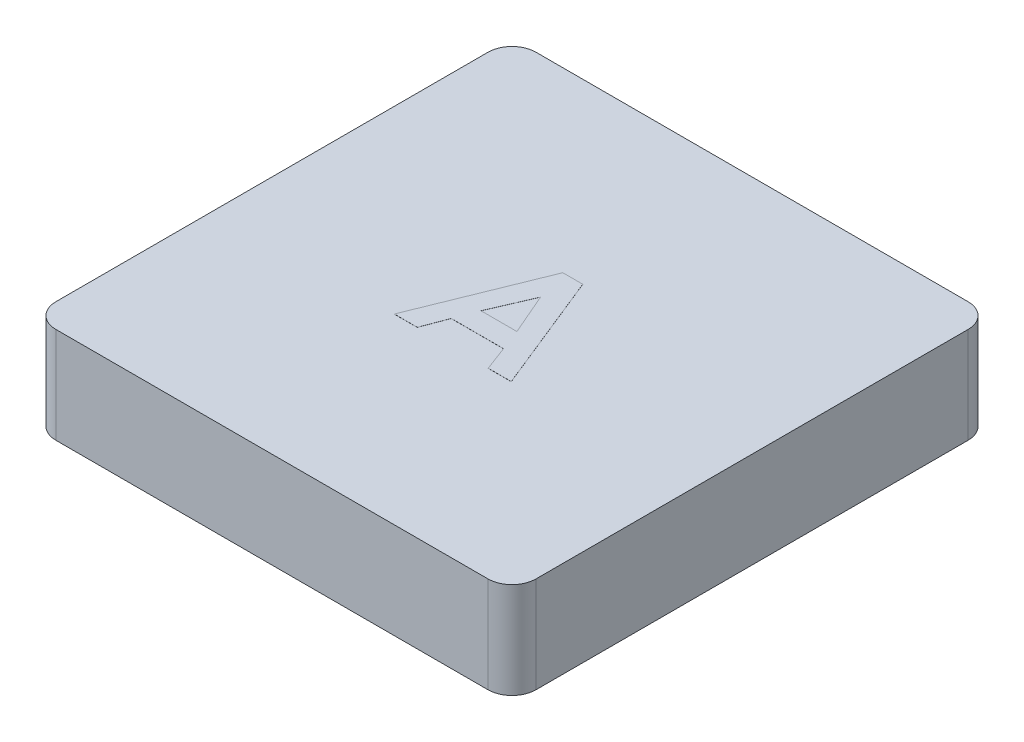
ISO-10303-21;
HEADER;
FILE_DESCRIPTION(('STEP AP214'),'2;1');
FILE_NAME('part.step','',(''),(''),'','','');
FILE_SCHEMA(('AUTOMOTIVE_DESIGN { 1 0 10303 214 1 1 1 1 }'));
ENDSEC;
DATA;
#1=APPLICATION_CONTEXT('core data for automotive mechanical design processes');
#2=APPLICATION_PROTOCOL_DEFINITION('international standard','automotive_design',2000,#1);
#3=PRODUCT_CONTEXT('',#1,'mechanical');
#4=PRODUCT('Part','Part','',(#3));
#5=PRODUCT_RELATED_PRODUCT_CATEGORY('part','',(#4));
#6=PRODUCT_DEFINITION_FORMATION('','',#4);
#7=PRODUCT_DEFINITION_CONTEXT('part definition',#1,'design');
#8=PRODUCT_DEFINITION('design','',#6,#7);
#9=PRODUCT_DEFINITION_SHAPE('','',#8);
#10=(LENGTH_UNIT() NAMED_UNIT(*) SI_UNIT(.MILLI.,.METRE.));
#11=(NAMED_UNIT(*) PLANE_ANGLE_UNIT() SI_UNIT($,.RADIAN.));
#12=(NAMED_UNIT(*) SI_UNIT($,.STERADIAN.) SOLID_ANGLE_UNIT());
#13=UNCERTAINTY_MEASURE_WITH_UNIT(LENGTH_MEASURE(1.E-05),#10,'distance_accuracy_value','');
#14=(GEOMETRIC_REPRESENTATION_CONTEXT(3) GLOBAL_UNCERTAINTY_ASSIGNED_CONTEXT((#13)) GLOBAL_UNIT_ASSIGNED_CONTEXT((#10,
#11,#12)) REPRESENTATION_CONTEXT('',''));
#15=CARTESIAN_POINT('',(0.,0.,0.));
#16=DIRECTION('',(0.,0.,1.));
#17=DIRECTION('',(1.,0.,0.));
#18=AXIS2_PLACEMENT_3D('',#15,#16,#17);
#19=CARTESIAN_POINT('',(0.,2.54,0.));
#20=DIRECTION('',(0.,1.,0.));
#21=DIRECTION('',(0.,0.,1.));
#22=AXIS2_PLACEMENT_3D('',#19,#20,#21);
#23=PLANE('',#22);
#24=DIRECTION('',(0.374622732778072,0.,-0.927177333677808));
#25=VECTOR('',#24,1.);
#26=CARTESIAN_POINT('',(4.76005769230769,2.54,-4.826));
#27=LINE('',#26,#25);
#28=CARTESIAN_POINT('',(4.76005769230769,2.54,-4.826));
#29=VERTEX_POINT('',#28);
#30=CARTESIAN_POINT('',(6.04290524839743,2.54,-8.001));
#31=VERTEX_POINT('',#30);
#32=EDGE_CURVE('E207',#29,#31,#27,.T.);
#33=ORIENTED_EDGE('',*,*,#32,.T.);
#34=DIRECTION('',(1.,0.,0.));
#35=VECTOR('',#34,1.);
#36=CARTESIAN_POINT('',(6.04290524839743,2.54,-8.001));
#37=LINE('',#36,#35);
#38=CARTESIAN_POINT('',(6.57143589743589,2.54,-8.001));
#39=VERTEX_POINT('',#38);
#40=EDGE_CURVE('E247',#31,#39,#37,.T.);
#41=ORIENTED_EDGE('',*,*,#40,.T.);
#42=DIRECTION('',(0.374463049601283,0.,0.92724183710794));
#43=VECTOR('',#42,1.);
#44=CARTESIAN_POINT('',(6.57143589743589,2.54,-8.001));
#45=LINE('',#44,#43);
#46=CARTESIAN_POINT('',(7.85364743589743,2.54,-4.826));
#47=VERTEX_POINT('',#46);
#48=EDGE_CURVE('E249',#39,#47,#45,.T.);
#49=ORIENTED_EDGE('',*,*,#48,.T.);
#50=DIRECTION('',(-1.,0.,0.));
#51=VECTOR('',#50,1.);
#52=CARTESIAN_POINT('',(7.85364743589743,2.54,-4.826));
#53=LINE('',#52,#51);
#54=CARTESIAN_POINT('',(7.24497856570512,2.54,-4.826));
#55=VERTEX_POINT('',#54);
#56=EDGE_CURVE('E251',#47,#55,#53,.T.);
#57=ORIENTED_EDGE('',*,*,#56,.T.);
#58=DIRECTION('',(-0.354323863096984,0.,-0.935122772709568));
#59=VECTOR('',#58,1.);
#60=CARTESIAN_POINT('',(7.24497856570512,2.54,-4.826));
#61=LINE('',#60,#59);
#62=CARTESIAN_POINT('',(6.99820372596154,2.54,-5.47728205128205));
#63=VERTEX_POINT('',#62);
#64=EDGE_CURVE('E253',#55,#63,#61,.T.);
#65=ORIENTED_EDGE('',*,*,#64,.T.);
#66=DIRECTION('',(-1.,0.,0.));
#67=VECTOR('',#66,1.);
#68=CARTESIAN_POINT('',(6.99820372596153,2.54,-5.47728205128205));
#69=LINE('',#68,#67);
#70=CARTESIAN_POINT('',(5.61486538461538,2.54,-5.47728205128205));
#71=VERTEX_POINT('',#70);
#72=EDGE_CURVE('E255',#63,#71,#69,.T.);
#73=ORIENTED_EDGE('',*,*,#72,.T.);
#74=DIRECTION('',(-0.354323863096985,0.,0.935122772709568));
#75=VECTOR('',#74,1.);
#76=CARTESIAN_POINT('',(5.61486538461538,2.54,-5.47728205128205));
#77=LINE('',#76,#75);
#78=CARTESIAN_POINT('',(5.36809054487179,2.54,-4.826));
#79=VERTEX_POINT('',#78);
#80=EDGE_CURVE('E53',#71,#79,#77,.T.);
#81=ORIENTED_EDGE('',*,*,#80,.T.);
#82=DIRECTION('',(-1.,0.,0.));
#83=VECTOR('',#82,1.);
#84=CARTESIAN_POINT('',(5.36809054487179,2.54,-4.826));
#85=LINE('',#84,#83);
#86=EDGE_CURVE('E48',#79,#29,#85,.T.);
#87=ORIENTED_EDGE('',*,*,#86,.T.);
#88=EDGE_LOOP('',(#33,#41,#49,#57,#65,#73,#81,#87));
#89=FACE_BOUND('',#88,.T.);
#90=DIRECTION('',(-1.,0.,0.));
#91=VECTOR('',#90,1.);
#92=CARTESIAN_POINT('',(12.7,2.54,-12.7));
#93=LINE('',#92,#91);
#94=CARTESIAN_POINT('',(12.065,2.54,-12.7));
#95=VERTEX_POINT('',#94);
#96=CARTESIAN_POINT('',(0.634999999999995,2.54,-12.7));
#97=VERTEX_POINT('',#96);
#98=EDGE_CURVE('E330',#95,#97,#93,.T.);
#99=ORIENTED_EDGE('',*,*,#98,.T.);
#100=CARTESIAN_POINT('',(0.634999999999995,2.54,-12.065));
#101=DIRECTION('',(0.,1.,0.));
#102=DIRECTION('',(0.,0.,1.));
#103=AXIS2_PLACEMENT_3D('',#100,#101,#102);
#104=CIRCLE('',#103,0.635);
#105=CARTESIAN_POINT('',(0.,2.54,-12.065));
#106=VERTEX_POINT('',#105);
#107=EDGE_CURVE('E367',#97,#106,#104,.T.);
#108=ORIENTED_EDGE('',*,*,#107,.T.);
#109=DIRECTION('',(0.,0.,1.));
#110=VECTOR('',#109,1.);
#111=CARTESIAN_POINT('',(0.,2.54,-12.7));
#112=LINE('',#111,#110);
#113=CARTESIAN_POINT('',(0.,2.54,-0.635));
#114=VERTEX_POINT('',#113);
#115=EDGE_CURVE('E320',#106,#114,#112,.T.);
#116=ORIENTED_EDGE('',*,*,#115,.T.);
#117=CARTESIAN_POINT('',(0.635,2.54,-0.635));
#118=DIRECTION('',(0.,1.,0.));
#119=DIRECTION('',(0.,0.,1.));
#120=AXIS2_PLACEMENT_3D('',#117,#118,#119);
#121=CIRCLE('',#120,0.635);
#122=CARTESIAN_POINT('',(0.635,2.54,0.));
#123=VERTEX_POINT('',#122);
#124=EDGE_CURVE('E361',#114,#123,#121,.T.);
#125=ORIENTED_EDGE('',*,*,#124,.T.);
#126=DIRECTION('',(1.,0.,0.));
#127=VECTOR('',#126,1.);
#128=CARTESIAN_POINT('',(0.,2.54,0.));
#129=LINE('',#128,#127);
#130=CARTESIAN_POINT('',(12.065,2.54,0.));
#131=VERTEX_POINT('',#130);
#132=EDGE_CURVE('E323',#123,#131,#129,.T.);
#133=ORIENTED_EDGE('',*,*,#132,.T.);
#134=CARTESIAN_POINT('',(12.065,2.54,-0.635));
#135=DIRECTION('',(0.,1.,0.));
#136=DIRECTION('',(0.,0.,1.));
#137=AXIS2_PLACEMENT_3D('',#134,#135,#136);
#138=CIRCLE('',#137,0.635);
#139=CARTESIAN_POINT('',(12.7,2.54,-0.635));
#140=VERTEX_POINT('',#139);
#141=EDGE_CURVE('E363',#131,#140,#138,.T.);
#142=ORIENTED_EDGE('',*,*,#141,.T.);
#143=DIRECTION('',(0.,0.,-1.));
#144=VECTOR('',#143,1.);
#145=CARTESIAN_POINT('',(12.7,2.54,0.));
#146=LINE('',#145,#144);
#147=CARTESIAN_POINT('',(12.7,2.54,-12.065));
#148=VERTEX_POINT('',#147);
#149=EDGE_CURVE('E327',#140,#148,#146,.T.);
#150=ORIENTED_EDGE('',*,*,#149,.T.);
#151=CARTESIAN_POINT('',(12.065,2.54,-12.065));
#152=DIRECTION('',(0.,1.,0.));
#153=DIRECTION('',(0.,0.,1.));
#154=AXIS2_PLACEMENT_3D('',#151,#152,#153);
#155=CIRCLE('',#154,0.635);
#156=EDGE_CURVE('E365',#148,#95,#155,.T.);
#157=ORIENTED_EDGE('',*,*,#156,.T.);
#158=EDGE_LOOP('',(#99,#108,#116,#125,#133,#142,#150,#157));
#159=FACE_BOUND('',#158,.T.);
#160=ADVANCED_FACE('F33',(#89,#159),#23,.T.);
#161=CARTESIAN_POINT('',(0.,2.54,-12.7));
#162=DIRECTION('',(1.,0.,0.));
#163=DIRECTION('',(0.,0.,-1.));
#164=AXIS2_PLACEMENT_3D('',#161,#162,#163);
#165=PLANE('',#164);
#166=ORIENTED_EDGE('',*,*,#115,.F.);
#167=DIRECTION('',(0.,-1.,0.));
#168=VECTOR('',#167,1.);
#169=CARTESIAN_POINT('',(0.,2.54,-12.065));
#170=LINE('',#169,#168);
#171=CARTESIAN_POINT('',(0.,0.,-12.065));
#172=VERTEX_POINT('',#171);
#173=EDGE_CURVE('E345',#106,#172,#170,.T.);
#174=ORIENTED_EDGE('',*,*,#173,.T.);
#175=DIRECTION('',(0.,0.,1.));
#176=VECTOR('',#175,1.);
#177=CARTESIAN_POINT('',(0.,0.,-12.7));
#178=LINE('',#177,#176);
#179=CARTESIAN_POINT('',(0.,0.,-0.635));
#180=VERTEX_POINT('',#179);
#181=EDGE_CURVE('E300',#172,#180,#178,.T.);
#182=ORIENTED_EDGE('',*,*,#181,.T.);
#183=DIRECTION('',(0.,-1.,0.));
#184=VECTOR('',#183,1.);
#185=CARTESIAN_POINT('',(0.,2.54,-0.635));
#186=LINE('',#185,#184);
#187=EDGE_CURVE('E333',#180,#114,#186,.F.);
#188=ORIENTED_EDGE('',*,*,#187,.T.);
#189=EDGE_LOOP('',(#166,#174,#182,#188));
#190=FACE_BOUND('',#189,.T.);
#191=ADVANCED_FACE('F411',(#190),#165,.F.);
#192=CARTESIAN_POINT('',(0.,2.54,0.));
#193=DIRECTION('',(0.,0.,-1.));
#194=DIRECTION('',(-1.,0.,0.));
#195=AXIS2_PLACEMENT_3D('',#192,#193,#194);
#196=PLANE('',#195);
#197=DIRECTION('',(1.,0.,0.));
#198=VECTOR('',#197,1.);
#199=CARTESIAN_POINT('',(0.,0.,0.));
#200=LINE('',#199,#198);
#201=CARTESIAN_POINT('',(0.635,0.,0.));
#202=VERTEX_POINT('',#201);
#203=CARTESIAN_POINT('',(12.065,0.,0.));
#204=VERTEX_POINT('',#203);
#205=EDGE_CURVE('E336',#202,#204,#200,.T.);
#206=ORIENTED_EDGE('',*,*,#205,.T.);
#207=DIRECTION('',(0.,-1.,0.));
#208=VECTOR('',#207,1.);
#209=CARTESIAN_POINT('',(12.065,2.54,0.));
#210=LINE('',#209,#208);
#211=EDGE_CURVE('E41',#204,#131,#210,.F.);
#212=ORIENTED_EDGE('',*,*,#211,.T.);
#213=ORIENTED_EDGE('',*,*,#132,.F.);
#214=DIRECTION('',(0.,-1.,0.));
#215=VECTOR('',#214,1.);
#216=CARTESIAN_POINT('',(0.635,2.54,0.));
#217=LINE('',#216,#215);
#218=EDGE_CURVE('E374',#123,#202,#217,.T.);
#219=ORIENTED_EDGE('',*,*,#218,.T.);
#220=EDGE_LOOP('',(#206,#212,#213,#219));
#221=FACE_BOUND('',#220,.T.);
#222=ADVANCED_FACE('F379',(#221),#196,.F.);
#223=CARTESIAN_POINT('',(12.7,2.54,0.));
#224=DIRECTION('',(-1.,0.,0.));
#225=DIRECTION('',(0.,0.,1.));
#226=AXIS2_PLACEMENT_3D('',#223,#224,#225);
#227=PLANE('',#226);
#228=DIRECTION('',(0.,0.,-1.));
#229=VECTOR('',#228,1.);
#230=CARTESIAN_POINT('',(12.7,0.,0.));
#231=LINE('',#230,#229);
#232=CARTESIAN_POINT('',(12.7,0.,-0.635));
#233=VERTEX_POINT('',#232);
#234=CARTESIAN_POINT('',(12.7,0.,-12.065));
#235=VERTEX_POINT('',#234);
#236=EDGE_CURVE('E339',#233,#235,#231,.T.);
#237=ORIENTED_EDGE('',*,*,#236,.T.);
#238=DIRECTION('',(0.,-1.,0.));
#239=VECTOR('',#238,1.);
#240=CARTESIAN_POINT('',(12.7,2.54,-12.065));
#241=LINE('',#240,#239);
#242=EDGE_CURVE('E372',#235,#148,#241,.F.);
#243=ORIENTED_EDGE('',*,*,#242,.T.);
#244=ORIENTED_EDGE('',*,*,#149,.F.);
#245=DIRECTION('',(0.,-1.,0.));
#246=VECTOR('',#245,1.);
#247=CARTESIAN_POINT('',(12.7,2.54,-0.635));
#248=LINE('',#247,#246);
#249=EDGE_CURVE('E369',#140,#233,#248,.T.);
#250=ORIENTED_EDGE('',*,*,#249,.T.);
#251=EDGE_LOOP('',(#237,#243,#244,#250));
#252=FACE_BOUND('',#251,.T.);
#253=ADVANCED_FACE('F391',(#252),#227,.F.);
#254=CARTESIAN_POINT('',(12.7,2.54,-12.7));
#255=DIRECTION('',(0.,0.,1.));
#256=DIRECTION('',(1.,0.,0.));
#257=AXIS2_PLACEMENT_3D('',#254,#255,#256);
#258=PLANE('',#257);
#259=DIRECTION('',(-1.,0.,0.));
#260=VECTOR('',#259,1.);
#261=CARTESIAN_POINT('',(12.7,0.,-12.7));
#262=LINE('',#261,#260);
#263=CARTESIAN_POINT('',(12.065,0.,-12.7));
#264=VERTEX_POINT('',#263);
#265=CARTESIAN_POINT('',(0.634999999999995,0.,-12.7));
#266=VERTEX_POINT('',#265);
#267=EDGE_CURVE('E324',#264,#266,#262,.T.);
#268=ORIENTED_EDGE('',*,*,#267,.T.);
#269=DIRECTION('',(0.,-1.,0.));
#270=VECTOR('',#269,1.);
#271=CARTESIAN_POINT('',(0.634999999999995,2.54,-12.7));
#272=LINE('',#271,#270);
#273=EDGE_CURVE('E359',#266,#97,#272,.F.);
#274=ORIENTED_EDGE('',*,*,#273,.T.);
#275=ORIENTED_EDGE('',*,*,#98,.F.);
#276=DIRECTION('',(0.,-1.,0.));
#277=VECTOR('',#276,1.);
#278=CARTESIAN_POINT('',(12.065,2.54,-12.7));
#279=LINE('',#278,#277);
#280=EDGE_CURVE('E356',#95,#264,#279,.T.);
#281=ORIENTED_EDGE('',*,*,#280,.T.);
#282=EDGE_LOOP('',(#268,#274,#275,#281));
#283=FACE_BOUND('',#282,.T.);
#284=ADVANCED_FACE('F403',(#283),#258,.F.);
#285=CARTESIAN_POINT('',(0.,0.,0.));
#286=DIRECTION('',(0.,1.,0.));
#287=DIRECTION('',(0.,0.,1.));
#288=AXIS2_PLACEMENT_3D('',#285,#286,#287);
#289=PLANE('',#288);
#290=DIRECTION('',(-1.,0.,0.));
#291=VECTOR('',#290,1.);
#292=CARTESIAN_POINT('',(12.7,0.,-12.065));
#293=LINE('',#292,#291);
#294=CARTESIAN_POINT('',(12.065,0.,-12.065));
#295=VERTEX_POINT('',#294);
#296=CARTESIAN_POINT('',(0.634999999999995,0.,-12.065));
#297=VERTEX_POINT('',#296);
#298=EDGE_CURVE('E288',#295,#297,#293,.T.);
#299=ORIENTED_EDGE('',*,*,#298,.T.);
#300=DIRECTION('',(0.,0.,1.));
#301=VECTOR('',#300,1.);
#302=CARTESIAN_POINT('',(0.634999999999995,0.,-12.7));
#303=LINE('',#302,#301);
#304=CARTESIAN_POINT('',(0.635,0.,-0.635));
#305=VERTEX_POINT('',#304);
#306=EDGE_CURVE('E283',#297,#305,#303,.T.);
#307=ORIENTED_EDGE('',*,*,#306,.T.);
#308=DIRECTION('',(1.,0.,0.));
#309=VECTOR('',#308,1.);
#310=CARTESIAN_POINT('',(0.,0.,-0.635));
#311=LINE('',#310,#309);
#312=CARTESIAN_POINT('',(12.065,0.,-0.635));
#313=VERTEX_POINT('',#312);
#314=EDGE_CURVE('E312',#305,#313,#311,.T.);
#315=ORIENTED_EDGE('',*,*,#314,.T.);
#316=DIRECTION('',(0.,0.,-1.));
#317=VECTOR('',#316,1.);
#318=CARTESIAN_POINT('',(12.065,0.,0.));
#319=LINE('',#318,#317);
#320=EDGE_CURVE('E315',#313,#295,#319,.T.);
#321=ORIENTED_EDGE('',*,*,#320,.T.);
#322=EDGE_LOOP('',(#299,#307,#315,#321));
#323=FACE_BOUND('',#322,.T.);
#324=ORIENTED_EDGE('',*,*,#181,.F.);
#325=CARTESIAN_POINT('',(0.634999999999995,0.,-12.065));
#326=DIRECTION('',(0.,1.,0.));
#327=DIRECTION('',(0.,0.,1.));
#328=AXIS2_PLACEMENT_3D('',#325,#326,#327);
#329=CIRCLE('',#328,0.635);
#330=EDGE_CURVE('E354',#172,#266,#329,.F.);
#331=ORIENTED_EDGE('',*,*,#330,.T.);
#332=ORIENTED_EDGE('',*,*,#267,.F.);
#333=CARTESIAN_POINT('',(12.065,0.,-12.065));
#334=DIRECTION('',(0.,1.,0.));
#335=DIRECTION('',(0.,0.,1.));
#336=AXIS2_PLACEMENT_3D('',#333,#334,#335);
#337=CIRCLE('',#336,0.635);
#338=EDGE_CURVE('E352',#264,#235,#337,.F.);
#339=ORIENTED_EDGE('',*,*,#338,.T.);
#340=ORIENTED_EDGE('',*,*,#236,.F.);
#341=CARTESIAN_POINT('',(12.065,0.,-0.635));
#342=DIRECTION('',(0.,1.,0.));
#343=DIRECTION('',(0.,0.,1.));
#344=AXIS2_PLACEMENT_3D('',#341,#342,#343);
#345=CIRCLE('',#344,0.635);
#346=EDGE_CURVE('E350',#233,#204,#345,.F.);
#347=ORIENTED_EDGE('',*,*,#346,.T.);
#348=ORIENTED_EDGE('',*,*,#205,.F.);
#349=CARTESIAN_POINT('',(0.635,0.,-0.635));
#350=DIRECTION('',(0.,1.,0.));
#351=DIRECTION('',(0.,0.,1.));
#352=AXIS2_PLACEMENT_3D('',#349,#350,#351);
#353=CIRCLE('',#352,0.635);
#354=EDGE_CURVE('E348',#202,#180,#353,.F.);
#355=ORIENTED_EDGE('',*,*,#354,.T.);
#356=EDGE_LOOP('',(#324,#331,#332,#339,#340,#347,#348,#355));
#357=FACE_BOUND('',#356,.T.);
#358=ADVANCED_FACE('F395',(#323,#357),#289,.F.);
#359=CARTESIAN_POINT('',(0.634999999999995,2.54,-12.065));
#360=DIRECTION('',(0.,-1.,0.));
#361=DIRECTION('',(0.,0.,-1.));
#362=AXIS2_PLACEMENT_3D('',#359,#360,#361);
#363=CYLINDRICAL_SURFACE('',#362,0.635);
#364=ORIENTED_EDGE('',*,*,#107,.F.);
#365=ORIENTED_EDGE('',*,*,#273,.F.);
#366=ORIENTED_EDGE('',*,*,#330,.F.);
#367=ORIENTED_EDGE('',*,*,#173,.F.);
#368=EDGE_LOOP('',(#364,#365,#366,#367));
#369=FACE_BOUND('',#368,.T.);
#370=ADVANCED_FACE('F409',(#369),#363,.T.);
#371=CARTESIAN_POINT('',(12.065,2.54,-12.065));
#372=DIRECTION('',(0.,-1.,0.));
#373=DIRECTION('',(0.,0.,-1.));
#374=AXIS2_PLACEMENT_3D('',#371,#372,#373);
#375=CYLINDRICAL_SURFACE('',#374,0.635);
#376=ORIENTED_EDGE('',*,*,#156,.F.);
#377=ORIENTED_EDGE('',*,*,#242,.F.);
#378=ORIENTED_EDGE('',*,*,#338,.F.);
#379=ORIENTED_EDGE('',*,*,#280,.F.);
#380=EDGE_LOOP('',(#376,#377,#378,#379));
#381=FACE_BOUND('',#380,.T.);
#382=ADVANCED_FACE('F400',(#381),#375,.T.);
#383=CARTESIAN_POINT('',(12.065,2.54,-0.635));
#384=DIRECTION('',(0.,-1.,0.));
#385=DIRECTION('',(0.,0.,-1.));
#386=AXIS2_PLACEMENT_3D('',#383,#384,#385);
#387=CYLINDRICAL_SURFACE('',#386,0.635);
#388=ORIENTED_EDGE('',*,*,#141,.F.);
#389=ORIENTED_EDGE('',*,*,#211,.F.);
#390=ORIENTED_EDGE('',*,*,#346,.F.);
#391=ORIENTED_EDGE('',*,*,#249,.F.);
#392=EDGE_LOOP('',(#388,#389,#390,#391));
#393=FACE_BOUND('',#392,.T.);
#394=ADVANCED_FACE('F388',(#393),#387,.T.);
#395=CARTESIAN_POINT('',(0.635,2.54,-0.635));
#396=DIRECTION('',(0.,-1.,0.));
#397=DIRECTION('',(0.,0.,-1.));
#398=AXIS2_PLACEMENT_3D('',#395,#396,#397);
#399=CYLINDRICAL_SURFACE('',#398,0.635);
#400=ORIENTED_EDGE('',*,*,#124,.F.);
#401=ORIENTED_EDGE('',*,*,#187,.F.);
#402=ORIENTED_EDGE('',*,*,#354,.F.);
#403=ORIENTED_EDGE('',*,*,#218,.F.);
#404=EDGE_LOOP('',(#400,#401,#402,#403));
#405=FACE_BOUND('',#404,.T.);
#406=ADVANCED_FACE('F35',(#405),#399,.T.);
#407=CARTESIAN_POINT('',(0.634999999999995,2.54,-12.7));
#408=DIRECTION('',(1.,0.,0.));
#409=DIRECTION('',(0.,0.,-1.));
#410=AXIS2_PLACEMENT_3D('',#407,#408,#409);
#411=PLANE('',#410);
#412=DIRECTION('',(0.,0.,1.));
#413=VECTOR('',#412,1.);
#414=CARTESIAN_POINT('',(0.634999999999995,1.905,-12.7));
#415=LINE('',#414,#413);
#416=CARTESIAN_POINT('',(0.634999999999995,1.905,-12.065));
#417=VERTEX_POINT('',#416);
#418=CARTESIAN_POINT('',(0.635,1.905,-0.635));
#419=VERTEX_POINT('',#418);
#420=EDGE_CURVE('E284',#417,#419,#415,.T.);
#421=ORIENTED_EDGE('',*,*,#420,.T.);
#422=DIRECTION('',(0.,1.,0.));
#423=VECTOR('',#422,1.);
#424=CARTESIAN_POINT('',(0.635,2.54,-0.635));
#425=LINE('',#424,#423);
#426=EDGE_CURVE('E293',#305,#419,#425,.T.);
#427=ORIENTED_EDGE('',*,*,#426,.F.);
#428=ORIENTED_EDGE('',*,*,#306,.F.);
#429=DIRECTION('',(0.,1.,0.));
#430=VECTOR('',#429,1.);
#431=CARTESIAN_POINT('',(0.634999999999995,2.54,-12.065));
#432=LINE('',#431,#430);
#433=EDGE_CURVE('E289',#297,#417,#432,.T.);
#434=ORIENTED_EDGE('',*,*,#433,.T.);
#435=EDGE_LOOP('',(#421,#427,#428,#434));
#436=FACE_BOUND('',#435,.T.);
#437=ADVANCED_FACE('F415',(#436),#411,.T.);
#438=CARTESIAN_POINT('',(0.,2.54,-0.635));
#439=DIRECTION('',(0.,0.,-1.));
#440=DIRECTION('',(-1.,0.,0.));
#441=AXIS2_PLACEMENT_3D('',#438,#439,#440);
#442=PLANE('',#441);
#443=ORIENTED_EDGE('',*,*,#314,.F.);
#444=ORIENTED_EDGE('',*,*,#426,.T.);
#445=DIRECTION('',(1.,0.,0.));
#446=VECTOR('',#445,1.);
#447=CARTESIAN_POINT('',(0.,1.905,-0.635));
#448=LINE('',#447,#446);
#449=CARTESIAN_POINT('',(12.065,1.905,-0.635));
#450=VERTEX_POINT('',#449);
#451=EDGE_CURVE('E287',#419,#450,#448,.T.);
#452=ORIENTED_EDGE('',*,*,#451,.T.);
#453=DIRECTION('',(0.,1.,0.));
#454=VECTOR('',#453,1.);
#455=CARTESIAN_POINT('',(12.065,2.54,-0.635));
#456=LINE('',#455,#454);
#457=EDGE_CURVE('E297',#313,#450,#456,.T.);
#458=ORIENTED_EDGE('',*,*,#457,.F.);
#459=EDGE_LOOP('',(#443,#444,#452,#458));
#460=FACE_BOUND('',#459,.T.);
#461=ADVANCED_FACE('F420',(#460),#442,.T.);
#462=CARTESIAN_POINT('',(12.065,2.54,0.));
#463=DIRECTION('',(-1.,0.,0.));
#464=DIRECTION('',(0.,0.,1.));
#465=AXIS2_PLACEMENT_3D('',#462,#463,#464);
#466=PLANE('',#465);
#467=ORIENTED_EDGE('',*,*,#320,.F.);
#468=ORIENTED_EDGE('',*,*,#457,.T.);
#469=DIRECTION('',(0.,0.,-1.));
#470=VECTOR('',#469,1.);
#471=CARTESIAN_POINT('',(12.065,1.905,0.));
#472=LINE('',#471,#470);
#473=CARTESIAN_POINT('',(12.065,1.905,-12.065));
#474=VERTEX_POINT('',#473);
#475=EDGE_CURVE('E303',#450,#474,#472,.T.);
#476=ORIENTED_EDGE('',*,*,#475,.T.);
#477=DIRECTION('',(0.,1.,0.));
#478=VECTOR('',#477,1.);
#479=CARTESIAN_POINT('',(12.065,2.54,-12.065));
#480=LINE('',#479,#478);
#481=EDGE_CURVE('E292',#295,#474,#480,.T.);
#482=ORIENTED_EDGE('',*,*,#481,.F.);
#483=EDGE_LOOP('',(#467,#468,#476,#482));
#484=FACE_BOUND('',#483,.T.);
#485=ADVANCED_FACE('F494',(#484),#466,.T.);
#486=CARTESIAN_POINT('',(12.7,2.54,-12.065));
#487=DIRECTION('',(0.,0.,1.));
#488=DIRECTION('',(1.,0.,0.));
#489=AXIS2_PLACEMENT_3D('',#486,#487,#488);
#490=PLANE('',#489);
#491=ORIENTED_EDGE('',*,*,#298,.F.);
#492=ORIENTED_EDGE('',*,*,#481,.T.);
#493=DIRECTION('',(-1.,0.,0.));
#494=VECTOR('',#493,1.);
#495=CARTESIAN_POINT('',(12.7,1.905,-12.065));
#496=LINE('',#495,#494);
#497=EDGE_CURVE('E296',#474,#417,#496,.T.);
#498=ORIENTED_EDGE('',*,*,#497,.T.);
#499=ORIENTED_EDGE('',*,*,#433,.F.);
#500=EDGE_LOOP('',(#491,#492,#498,#499));
#501=FACE_BOUND('',#500,.T.);
#502=ADVANCED_FACE('F498',(#501),#490,.T.);
#503=CARTESIAN_POINT('',(0.,1.905,0.));
#504=DIRECTION('',(0.,1.,0.));
#505=DIRECTION('',(0.,0.,1.));
#506=AXIS2_PLACEMENT_3D('',#503,#504,#505);
#507=PLANE('',#506);
#508=CARTESIAN_POINT('',(6.34999999999999,1.905,-6.35));
#509=DIRECTION('',(0.,1.,0.));
#510=DIRECTION('',(0.,0.,1.));
#511=AXIS2_PLACEMENT_3D('',#508,#509,#510);
#512=CIRCLE('',#511,2.54);
#513=CARTESIAN_POINT('',(6.34999999999999,1.905,-3.81));
#514=VERTEX_POINT('',#513);
#515=EDGE_CURVE('E11',#514,#514,#512,.F.);
#516=ORIENTED_EDGE('',*,*,#515,.F.);
#517=EDGE_LOOP('',(#516));
#518=FACE_BOUND('',#517,.T.);
#519=ORIENTED_EDGE('',*,*,#497,.F.);
#520=ORIENTED_EDGE('',*,*,#475,.F.);
#521=ORIENTED_EDGE('',*,*,#451,.F.);
#522=ORIENTED_EDGE('',*,*,#420,.F.);
#523=EDGE_LOOP('',(#519,#520,#521,#522));
#524=FACE_BOUND('',#523,.T.);
#525=ADVANCED_FACE('F489',(#518,#524),#507,.F.);
#526=CARTESIAN_POINT('',(6.34999999999999,-7.18420489685532,-6.35));
#527=DIRECTION('',(0.,1.,0.));
#528=DIRECTION('',(0.,0.,1.));
#529=AXIS2_PLACEMENT_3D('',#526,#527,#528);
#530=CYLINDRICAL_SURFACE('',#529,2.54);
#531=CARTESIAN_POINT('',(6.34999999999999,0.,-6.35));
#532=DIRECTION('',(0.,1.,0.));
#533=DIRECTION('',(0.,0.,1.));
#534=AXIS2_PLACEMENT_3D('',#531,#532,#533);
#535=CIRCLE('',#534,2.54);
#536=CARTESIAN_POINT('',(6.34999999999999,0.,-3.81));
#537=VERTEX_POINT('',#536);
#538=EDGE_CURVE('E261',#537,#537,#535,.T.);
#539=CARTESIAN_POINT('',(6.34999999999999,0.,-3.81));
#540=CARTESIAN_POINT('',(6.34999999999999,0.0198437499999991,-3.81));
#541=CARTESIAN_POINT('',(6.34999999999999,0.0396874999999989,-3.81));
#542=CARTESIAN_POINT('',(6.34999999999999,0.079374999999999,-3.81));
#543=CARTESIAN_POINT('',(6.34999999999999,0.0992187499999992,-3.81));
#544=CARTESIAN_POINT('',(6.34999999999999,0.138906249999999,-3.81));
#545=CARTESIAN_POINT('',(6.34999999999999,0.158749999999999,-3.81));
#546=CARTESIAN_POINT('',(6.34999999999999,0.198437499999999,-3.81));
#547=CARTESIAN_POINT('',(6.34999999999999,0.218281249999999,-3.81));
#548=CARTESIAN_POINT('',(6.34999999999999,0.25796875,-3.81));
#549=CARTESIAN_POINT('',(6.34999999999999,0.277812499999999,-3.81));
#550=CARTESIAN_POINT('',(6.34999999999999,0.317499999999999,-3.81));
#551=CARTESIAN_POINT('',(6.34999999999999,0.337343749999999,-3.81));
#552=CARTESIAN_POINT('',(6.34999999999999,0.377031249999999,-3.81));
#553=CARTESIAN_POINT('',(6.34999999999999,0.396874999999999,-3.81));
#554=CARTESIAN_POINT('',(6.34999999999999,0.436562499999999,-3.81));
#555=CARTESIAN_POINT('',(6.34999999999999,0.456406249999999,-3.81));
#556=CARTESIAN_POINT('',(6.34999999999999,0.496093749999999,-3.81));
#557=CARTESIAN_POINT('',(6.34999999999999,0.515937499999999,-3.81));
#558=CARTESIAN_POINT('',(6.34999999999999,0.555624999999999,-3.81));
#559=CARTESIAN_POINT('',(6.34999999999999,0.575468749999999,-3.81));
#560=CARTESIAN_POINT('',(6.34999999999999,0.615156249999999,-3.81));
#561=CARTESIAN_POINT('',(6.34999999999999,0.634999999999999,-3.81));
#562=CARTESIAN_POINT('',(6.34999999999999,0.674687499999998,-3.81));
#563=CARTESIAN_POINT('',(6.34999999999999,0.694531249999998,-3.81));
#564=CARTESIAN_POINT('',(6.34999999999999,0.734218749999998,-3.81));
#565=CARTESIAN_POINT('',(6.34999999999999,0.754062499999998,-3.81));
#566=CARTESIAN_POINT('',(6.34999999999999,0.793749999999998,-3.81));
#567=CARTESIAN_POINT('',(6.34999999999999,0.813593749999999,-3.81));
#568=CARTESIAN_POINT('',(6.34999999999999,0.853281249999999,-3.81));
#569=CARTESIAN_POINT('',(6.34999999999999,0.873124999999999,-3.81));
#570=CARTESIAN_POINT('',(6.34999999999999,0.912812499999999,-3.81));
#571=CARTESIAN_POINT('',(6.34999999999999,0.932656249999999,-3.81));
#572=CARTESIAN_POINT('',(6.34999999999999,0.972343749999998,-3.81));
#573=CARTESIAN_POINT('',(6.34999999999999,0.992187499999998,-3.81));
#574=CARTESIAN_POINT('',(6.34999999999999,1.031875,-3.81));
#575=CARTESIAN_POINT('',(6.34999999999999,1.05171875,-3.81));
#576=CARTESIAN_POINT('',(6.34999999999999,1.09140625,-3.81));
#577=CARTESIAN_POINT('',(6.34999999999999,1.11125,-3.81));
#578=CARTESIAN_POINT('',(6.34999999999999,1.1509375,-3.81));
#579=CARTESIAN_POINT('',(6.34999999999999,1.17078125,-3.81));
#580=CARTESIAN_POINT('',(6.34999999999999,1.21046875,-3.81));
#581=CARTESIAN_POINT('',(6.34999999999999,1.2303125,-3.81));
#582=CARTESIAN_POINT('',(6.34999999999999,1.27,-3.81));
#583=CARTESIAN_POINT('',(6.34999999999999,1.28984375,-3.81));
#584=CARTESIAN_POINT('',(6.34999999999999,1.32953125,-3.81));
#585=CARTESIAN_POINT('',(6.34999999999999,1.349375,-3.81));
#586=CARTESIAN_POINT('',(6.34999999999999,1.3890625,-3.81));
#587=CARTESIAN_POINT('',(6.34999999999999,1.40890625,-3.81));
#588=CARTESIAN_POINT('',(6.34999999999999,1.44859375,-3.81));
#589=CARTESIAN_POINT('',(6.34999999999999,1.4684375,-3.81));
#590=CARTESIAN_POINT('',(6.34999999999999,1.508125,-3.81));
#591=CARTESIAN_POINT('',(6.34999999999999,1.52796875,-3.81));
#592=CARTESIAN_POINT('',(6.34999999999999,1.56765625,-3.81));
#593=CARTESIAN_POINT('',(6.34999999999999,1.5875,-3.81));
#594=CARTESIAN_POINT('',(6.34999999999999,1.6271875,-3.81));
#595=CARTESIAN_POINT('',(6.34999999999999,1.64703125,-3.81));
#596=CARTESIAN_POINT('',(6.34999999999999,1.68671875,-3.81));
#597=CARTESIAN_POINT('',(6.34999999999999,1.7065625,-3.81));
#598=CARTESIAN_POINT('',(6.34999999999999,1.74625,-3.81));
#599=CARTESIAN_POINT('',(6.34999999999999,1.76609375,-3.81));
#600=CARTESIAN_POINT('',(6.34999999999999,1.80578125,-3.81));
#601=CARTESIAN_POINT('',(6.34999999999999,1.825625,-3.81));
#602=CARTESIAN_POINT('',(6.34999999999999,1.8653125,-3.81));
#603=CARTESIAN_POINT('',(6.34999999999999,1.88515625,-3.81));
#604=CARTESIAN_POINT('',(6.34999999999999,1.905,-3.81));
#605=B_SPLINE_CURVE_WITH_KNOTS('',3,(#539,#540,#541,#542,#543,#544,#545,#546,#547,#548,#549,
#550,#551,#552,#553,#554,#555,#556,#557,#558,#559,#560,#561,#562,#563,#564,#565,#566,#567,#568,
#569,#570,#571,#572,#573,#574,#575,#576,#577,#578,#579,#580,#581,#582,#583,#584,#585,#586,#587,
#588,#589,#590,#591,#592,#593,#594,#595,#596,#597,#598,#599,#600,#601,#602,#603,#604),
.UNSPECIFIED.,.F.,.F.,(4,2,2,2,2,2,2,2,2,2,2,2,2,2,2,2,2,2,2,2,2,2,2,2,2,2,2,2,2,2,2,2,4),(0.,
0.0595312499999997,0.1190625,0.17859375,0.238125,0.29765625,0.3571875,0.41671875,0.47625,
0.53578125,0.5953125,0.654843749999999,0.714374999999999,0.773906249999999,0.8334375,0.89296875,
0.952499999999999,1.01203125,1.0715625,1.13109375,1.190625,1.25015625,1.3096875,1.36921875,
1.42875,1.48828125,1.5478125,1.60734375,1.666875,1.72640625,1.7859375,1.84546875,1.905),.UNSPECIFIED.);
#606=EDGE_CURVE('BSEAM486',#537,#514,#605,.T.);
#607=ORIENTED_EDGE('',*,*,#538,.T.);
#608=ORIENTED_EDGE('',*,*,#515,.T.);
#609=ORIENTED_EDGE('',*,*,#606,.T.);
#610=ORIENTED_EDGE('',*,*,#606,.F.);
#611=EDGE_LOOP('',(#607,#609,#608,#610));
#612=FACE_BOUND('',#611,.T.);
#613=ADVANCED_FACE('F486',(#612),#530,.T.);
#614=CARTESIAN_POINT('',(0.,0.,0.));
#615=DIRECTION('',(0.,1.,0.));
#616=DIRECTION('',(0.,0.,1.));
#617=AXIS2_PLACEMENT_3D('',#614,#615,#616);
#618=PLANE('',#617);
#619=ORIENTED_EDGE('',*,*,#538,.F.);
#620=EDGE_LOOP('',(#619));
#621=FACE_BOUND('',#620,.T.);
#622=ADVANCED_FACE('F452',(#621),#618,.F.);
#623=CARTESIAN_POINT('',(0.,2.54254,0.));
#624=DIRECTION('',(0.,-1.,0.));
#625=DIRECTION('',(0.,0.,-1.));
#626=AXIS2_PLACEMENT_3D('',#623,#624,#625);
#627=PLANE('',#626);
#628=DIRECTION('',(0.374622732778072,0.,-0.927177333677808));
#629=VECTOR('',#628,1.);
#630=CARTESIAN_POINT('',(4.76005769230769,2.54254,-4.826));
#631=LINE('',#630,#629);
#632=CARTESIAN_POINT('',(4.76005769230769,2.54254,-4.826));
#633=VERTEX_POINT('',#632);
#634=CARTESIAN_POINT('',(6.04290524839743,2.54254,-8.001));
#635=VERTEX_POINT('',#634);
#636=EDGE_CURVE('E221',#633,#635,#631,.T.);
#637=ORIENTED_EDGE('',*,*,#636,.F.);
#638=DIRECTION('',(-1.,0.,0.));
#639=VECTOR('',#638,1.);
#640=CARTESIAN_POINT('',(5.36809054487179,2.54254,-4.826));
#641=LINE('',#640,#639);
#642=CARTESIAN_POINT('',(5.36809054487179,2.54254,-4.826));
#643=VERTEX_POINT('',#642);
#644=EDGE_CURVE('E242',#643,#633,#641,.T.);
#645=ORIENTED_EDGE('',*,*,#644,.F.);
#646=DIRECTION('',(-0.354323863096985,0.,0.935122772709568));
#647=VECTOR('',#646,1.);
#648=CARTESIAN_POINT('',(5.61486538461538,2.54254,-5.47728205128205));
#649=LINE('',#648,#647);
#650=CARTESIAN_POINT('',(5.61486538461538,2.54254,-5.47728205128205));
#651=VERTEX_POINT('',#650);
#652=EDGE_CURVE('E239',#651,#643,#649,.T.);
#653=ORIENTED_EDGE('',*,*,#652,.F.);
#654=DIRECTION('',(-1.,0.,0.));
#655=VECTOR('',#654,1.);
#656=CARTESIAN_POINT('',(6.99820372596153,2.54254,-5.47728205128205));
#657=LINE('',#656,#655);
#658=CARTESIAN_POINT('',(6.99820372596153,2.54254,-5.47728205128205));
#659=VERTEX_POINT('',#658);
#660=EDGE_CURVE('E236',#659,#651,#657,.T.);
#661=ORIENTED_EDGE('',*,*,#660,.F.);
#662=DIRECTION('',(-0.354323863096984,0.,-0.935122772709568));
#663=VECTOR('',#662,1.);
#664=CARTESIAN_POINT('',(7.24497856570512,2.54254,-4.826));
#665=LINE('',#664,#663);
#666=CARTESIAN_POINT('',(7.24497856570512,2.54254,-4.826));
#667=VERTEX_POINT('',#666);
#668=EDGE_CURVE('E233',#667,#659,#665,.T.);
#669=ORIENTED_EDGE('',*,*,#668,.F.);
#670=DIRECTION('',(-1.,0.,0.));
#671=VECTOR('',#670,1.);
#672=CARTESIAN_POINT('',(7.85364743589743,2.54254,-4.826));
#673=LINE('',#672,#671);
#674=CARTESIAN_POINT('',(7.85364743589743,2.54254,-4.826));
#675=VERTEX_POINT('',#674);
#676=EDGE_CURVE('E230',#675,#667,#673,.T.);
#677=ORIENTED_EDGE('',*,*,#676,.F.);
#678=DIRECTION('',(0.374463049601283,0.,0.92724183710794));
#679=VECTOR('',#678,1.);
#680=CARTESIAN_POINT('',(6.57143589743589,2.54254,-8.001));
#681=LINE('',#680,#679);
#682=CARTESIAN_POINT('',(6.57143589743589,2.54254,-8.001));
#683=VERTEX_POINT('',#682);
#684=EDGE_CURVE('E227',#683,#675,#681,.T.);
#685=ORIENTED_EDGE('',*,*,#684,.F.);
#686=DIRECTION('',(1.,0.,0.));
#687=VECTOR('',#686,1.);
#688=CARTESIAN_POINT('',(6.04290524839743,2.54254,-8.001));
#689=LINE('',#688,#687);
#690=EDGE_CURVE('E224',#635,#683,#689,.T.);
#691=ORIENTED_EDGE('',*,*,#690,.F.);
#692=EDGE_LOOP('',(#637,#645,#653,#661,#669,#677,#685,#691));
#693=FACE_BOUND('',#692,.T.);
#694=DIRECTION('',(-0.396283785267296,0.,-0.91812807469014));
#695=VECTOR('',#694,1.);
#696=CARTESIAN_POINT('',(6.78259374999999,2.54254,-6.04715384615385));
#697=LINE('',#696,#695);
#698=CARTESIAN_POINT('',(6.78259374999999,2.54254,-6.04715384615385));
#699=VERTEX_POINT('',#698);
#700=CARTESIAN_POINT('',(6.30685256410256,2.54254,-7.14937239583333));
#701=VERTEX_POINT('',#700);
#702=EDGE_CURVE('E188',#699,#701,#697,.T.);
#703=ORIENTED_EDGE('',*,*,#702,.F.);
#704=DIRECTION('',(1.,0.,0.));
#705=VECTOR('',#704,1.);
#706=CARTESIAN_POINT('',(5.83111137820512,2.54254,-6.04715384615385));
#707=LINE('',#706,#705);
#708=CARTESIAN_POINT('',(5.83111137820512,2.54254,-6.04715384615385));
#709=VERTEX_POINT('',#708);
#710=EDGE_CURVE('E211',#709,#699,#707,.T.);
#711=ORIENTED_EDGE('',*,*,#710,.F.);
#712=DIRECTION('',(-0.396283785267296,0.,0.91812807469014));
#713=VECTOR('',#712,1.);
#714=CARTESIAN_POINT('',(6.30685256410256,2.54254,-7.14937239583333));
#715=LINE('',#714,#713);
#716=EDGE_CURVE('E198',#701,#709,#715,.T.);
#717=ORIENTED_EDGE('',*,*,#716,.F.);
#718=EDGE_LOOP('',(#703,#711,#717));
#719=FACE_BOUND('',#718,.T.);
#720=ADVANCED_FACE('F210',(#693,#719),#627,.F.);
#721=CARTESIAN_POINT('',(4.76005769230769,2.54254,-4.826));
#722=DIRECTION('',(-0.927177333677808,0.,-0.374622732778072));
#723=DIRECTION('',(-0.374622732778072,0.,0.927177333677808));
#724=AXIS2_PLACEMENT_3D('',#721,#722,#723);
#725=PLANE('',#724);
#726=ORIENTED_EDGE('',*,*,#32,.F.);
#727=DIRECTION('',(0.,-1.,0.));
#728=VECTOR('',#727,1.);
#729=CARTESIAN_POINT('',(4.76005769230769,2.54254,-4.826));
#730=LINE('',#729,#728);
#731=EDGE_CURVE('E259',#633,#29,#730,.T.);
#732=ORIENTED_EDGE('',*,*,#731,.F.);
#733=ORIENTED_EDGE('',*,*,#636,.T.);
#734=DIRECTION('',(0.,-1.,0.));
#735=VECTOR('',#734,1.);
#736=CARTESIAN_POINT('',(6.04290524839743,2.54254,-8.001));
#737=LINE('',#736,#735);
#738=EDGE_CURVE('E245',#635,#31,#737,.T.);
#739=ORIENTED_EDGE('',*,*,#738,.T.);
#740=EDGE_LOOP('',(#726,#732,#733,#739));
#741=FACE_BOUND('',#740,.T.);
#742=ADVANCED_FACE('F451',(#741),#725,.T.);
#743=CARTESIAN_POINT('',(5.36809054487179,2.54254,-4.826));
#744=DIRECTION('',(0.,0.,1.));
#745=DIRECTION('',(1.,0.,0.));
#746=AXIS2_PLACEMENT_3D('',#743,#744,#745);
#747=PLANE('',#746);
#748=ORIENTED_EDGE('',*,*,#86,.F.);
#749=DIRECTION('',(0.,-1.,0.));
#750=VECTOR('',#749,1.);
#751=CARTESIAN_POINT('',(5.36809054487179,2.54254,-4.826));
#752=LINE('',#751,#750);
#753=EDGE_CURVE('E262',#643,#79,#752,.T.);
#754=ORIENTED_EDGE('',*,*,#753,.F.);
#755=ORIENTED_EDGE('',*,*,#644,.T.);
#756=ORIENTED_EDGE('',*,*,#731,.T.);
#757=EDGE_LOOP('',(#748,#754,#755,#756));
#758=FACE_BOUND('',#757,.T.);
#759=ADVANCED_FACE('F454',(#758),#747,.T.);
#760=CARTESIAN_POINT('',(5.61486538461538,2.54254,-5.47728205128205));
#761=DIRECTION('',(0.935122772709568,0.,0.354323863096985));
#762=DIRECTION('',(0.354323863096985,0.,-0.935122772709568));
#763=AXIS2_PLACEMENT_3D('',#760,#761,#762);
#764=PLANE('',#763);
#765=ORIENTED_EDGE('',*,*,#80,.F.);
#766=DIRECTION('',(0.,-1.,0.));
#767=VECTOR('',#766,1.);
#768=CARTESIAN_POINT('',(5.61486538461538,2.54254,-5.47728205128205));
#769=LINE('',#768,#767);
#770=EDGE_CURVE('E264',#651,#71,#769,.T.);
#771=ORIENTED_EDGE('',*,*,#770,.F.);
#772=ORIENTED_EDGE('',*,*,#652,.T.);
#773=ORIENTED_EDGE('',*,*,#753,.T.);
#774=EDGE_LOOP('',(#765,#771,#772,#773));
#775=FACE_BOUND('',#774,.T.);
#776=ADVANCED_FACE('F457',(#775),#764,.T.);
#777=CARTESIAN_POINT('',(6.99820372596153,2.54254,-5.47728205128205));
#778=DIRECTION('',(0.,0.,1.));
#779=DIRECTION('',(1.,0.,0.));
#780=AXIS2_PLACEMENT_3D('',#777,#778,#779);
#781=PLANE('',#780);
#782=ORIENTED_EDGE('',*,*,#72,.F.);
#783=DIRECTION('',(0.,-1.,0.));
#784=VECTOR('',#783,1.);
#785=CARTESIAN_POINT('',(6.99820372596153,2.54254,-5.47728205128205));
#786=LINE('',#785,#784);
#787=EDGE_CURVE('E267',#659,#63,#786,.T.);
#788=ORIENTED_EDGE('',*,*,#787,.F.);
#789=ORIENTED_EDGE('',*,*,#660,.T.);
#790=ORIENTED_EDGE('',*,*,#770,.T.);
#791=EDGE_LOOP('',(#782,#788,#789,#790));
#792=FACE_BOUND('',#791,.T.);
#793=ADVANCED_FACE('F461',(#792),#781,.T.);
#794=CARTESIAN_POINT('',(7.24497856570512,2.54254,-4.826));
#795=DIRECTION('',(-0.935122772709568,0.,0.354323863096984));
#796=DIRECTION('',(0.354323863096984,0.,0.935122772709568));
#797=AXIS2_PLACEMENT_3D('',#794,#795,#796);
#798=PLANE('',#797);
#799=ORIENTED_EDGE('',*,*,#64,.F.);
#800=DIRECTION('',(0.,-1.,0.));
#801=VECTOR('',#800,1.);
#802=CARTESIAN_POINT('',(7.24497856570512,2.54254,-4.826));
#803=LINE('',#802,#801);
#804=EDGE_CURVE('E270',#667,#55,#803,.T.);
#805=ORIENTED_EDGE('',*,*,#804,.F.);
#806=ORIENTED_EDGE('',*,*,#668,.T.);
#807=ORIENTED_EDGE('',*,*,#787,.T.);
#808=EDGE_LOOP('',(#799,#805,#806,#807));
#809=FACE_BOUND('',#808,.T.);
#810=ADVANCED_FACE('F465',(#809),#798,.T.);
#811=CARTESIAN_POINT('',(7.85364743589743,2.54254,-4.826));
#812=DIRECTION('',(0.,0.,1.));
#813=DIRECTION('',(1.,0.,0.));
#814=AXIS2_PLACEMENT_3D('',#811,#812,#813);
#815=PLANE('',#814);
#816=ORIENTED_EDGE('',*,*,#56,.F.);
#817=DIRECTION('',(0.,-1.,0.));
#818=VECTOR('',#817,1.);
#819=CARTESIAN_POINT('',(7.85364743589743,2.54254,-4.826));
#820=LINE('',#819,#818);
#821=EDGE_CURVE('E273',#675,#47,#820,.T.);
#822=ORIENTED_EDGE('',*,*,#821,.F.);
#823=ORIENTED_EDGE('',*,*,#676,.T.);
#824=ORIENTED_EDGE('',*,*,#804,.T.);
#825=EDGE_LOOP('',(#816,#822,#823,#824));
#826=FACE_BOUND('',#825,.T.);
#827=ADVANCED_FACE('F469',(#826),#815,.T.);
#828=CARTESIAN_POINT('',(6.57143589743589,2.54254,-8.001));
#829=DIRECTION('',(0.92724183710794,0.,-0.374463049601283));
#830=DIRECTION('',(-0.374463049601283,0.,-0.92724183710794));
#831=AXIS2_PLACEMENT_3D('',#828,#829,#830);
#832=PLANE('',#831);
#833=ORIENTED_EDGE('',*,*,#48,.F.);
#834=DIRECTION('',(0.,-1.,0.));
#835=VECTOR('',#834,1.);
#836=CARTESIAN_POINT('',(6.57143589743589,2.54254,-8.001));
#837=LINE('',#836,#835);
#838=EDGE_CURVE('E276',#683,#39,#837,.T.);
#839=ORIENTED_EDGE('',*,*,#838,.F.);
#840=ORIENTED_EDGE('',*,*,#684,.T.);
#841=ORIENTED_EDGE('',*,*,#821,.T.);
#842=EDGE_LOOP('',(#833,#839,#840,#841));
#843=FACE_BOUND('',#842,.T.);
#844=ADVANCED_FACE('F473',(#843),#832,.T.);
#845=CARTESIAN_POINT('',(6.04290524839743,2.54254,-8.001));
#846=DIRECTION('',(0.,0.,-1.));
#847=DIRECTION('',(-1.,0.,0.));
#848=AXIS2_PLACEMENT_3D('',#845,#846,#847);
#849=PLANE('',#848);
#850=ORIENTED_EDGE('',*,*,#40,.F.);
#851=ORIENTED_EDGE('',*,*,#738,.F.);
#852=ORIENTED_EDGE('',*,*,#690,.T.);
#853=ORIENTED_EDGE('',*,*,#838,.T.);
#854=EDGE_LOOP('',(#850,#851,#852,#853));
#855=FACE_BOUND('',#854,.T.);
#856=ADVANCED_FACE('F448',(#855),#849,.T.);
#857=CARTESIAN_POINT('',(6.78259374999999,2.54254,-6.04715384615385));
#858=DIRECTION('',(-0.91812807469014,0.,0.396283785267296));
#859=DIRECTION('',(0.396283785267296,0.,0.91812807469014));
#860=AXIS2_PLACEMENT_3D('',#857,#858,#859);
#861=PLANE('',#860);
#862=DIRECTION('',(-0.396283785267296,0.,-0.91812807469014));
#863=VECTOR('',#862,1.);
#864=CARTESIAN_POINT('',(6.78259374999999,2.54,-6.04715384615385));
#865=LINE('',#864,#863);
#866=CARTESIAN_POINT('',(6.78259374999999,2.54,-6.04715384615385));
#867=VERTEX_POINT('',#866);
#868=CARTESIAN_POINT('',(6.30685256410256,2.54,-7.14937239583333));
#869=VERTEX_POINT('',#868);
#870=EDGE_CURVE('E215',#867,#869,#865,.T.);
#871=ORIENTED_EDGE('',*,*,#870,.F.);
#872=DIRECTION('',(0.,-1.,0.));
#873=VECTOR('',#872,1.);
#874=CARTESIAN_POINT('',(6.78259374999999,2.54254,-6.04715384615385));
#875=LINE('',#874,#873);
#876=EDGE_CURVE('E194',#699,#867,#875,.T.);
#877=ORIENTED_EDGE('',*,*,#876,.F.);
#878=ORIENTED_EDGE('',*,*,#702,.T.);
#879=DIRECTION('',(0.,-1.,0.));
#880=VECTOR('',#879,1.);
#881=CARTESIAN_POINT('',(6.30685256410256,2.54254,-7.14937239583333));
#882=LINE('',#881,#880);
#883=EDGE_CURVE('E192',#701,#869,#882,.T.);
#884=ORIENTED_EDGE('',*,*,#883,.T.);
#885=EDGE_LOOP('',(#871,#877,#878,#884));
#886=FACE_BOUND('',#885,.T.);
#887=ADVANCED_FACE('F191',(#886),#861,.T.);
#888=CARTESIAN_POINT('',(6.30685256410256,2.54254,-7.14937239583333));
#889=DIRECTION('',(0.91812807469014,0.,0.396283785267296));
#890=DIRECTION('',(0.396283785267296,0.,-0.91812807469014));
#891=AXIS2_PLACEMENT_3D('',#888,#889,#890);
#892=PLANE('',#891);
#893=DIRECTION('',(-0.396283785267296,0.,0.91812807469014));
#894=VECTOR('',#893,1.);
#895=CARTESIAN_POINT('',(6.30685256410256,2.54,-7.14937239583333));
#896=LINE('',#895,#894);
#897=CARTESIAN_POINT('',(5.83111137820512,2.54,-6.04715384615385));
#898=VERTEX_POINT('',#897);
#899=EDGE_CURVE('E206',#869,#898,#896,.T.);
#900=ORIENTED_EDGE('',*,*,#899,.F.);
#901=ORIENTED_EDGE('',*,*,#883,.F.);
#902=ORIENTED_EDGE('',*,*,#716,.T.);
#903=DIRECTION('',(0.,-1.,0.));
#904=VECTOR('',#903,1.);
#905=CARTESIAN_POINT('',(5.83111137820512,2.54254,-6.04715384615385));
#906=LINE('',#905,#904);
#907=EDGE_CURVE('E208',#709,#898,#906,.T.);
#908=ORIENTED_EDGE('',*,*,#907,.T.);
#909=EDGE_LOOP('',(#900,#901,#902,#908));
#910=FACE_BOUND('',#909,.T.);
#911=ADVANCED_FACE('F204',(#910),#892,.T.);
#912=CARTESIAN_POINT('',(5.83111137820512,2.54254,-6.04715384615385));
#913=DIRECTION('',(0.,0.,-1.));
#914=DIRECTION('',(-1.,0.,0.));
#915=AXIS2_PLACEMENT_3D('',#912,#913,#914);
#916=PLANE('',#915);
#917=DIRECTION('',(1.,0.,0.));
#918=VECTOR('',#917,1.);
#919=CARTESIAN_POINT('',(5.83111137820512,2.54,-6.04715384615385));
#920=LINE('',#919,#918);
#921=EDGE_CURVE('E199',#898,#867,#920,.T.);
#922=ORIENTED_EDGE('',*,*,#921,.F.);
#923=ORIENTED_EDGE('',*,*,#907,.F.);
#924=ORIENTED_EDGE('',*,*,#710,.T.);
#925=ORIENTED_EDGE('',*,*,#876,.T.);
#926=EDGE_LOOP('',(#922,#923,#924,#925));
#927=FACE_BOUND('',#926,.T.);
#928=ADVANCED_FACE('F433',(#927),#916,.T.);
#929=ORIENTED_EDGE('',*,*,#870,.T.);
#930=ORIENTED_EDGE('',*,*,#899,.T.);
#931=ORIENTED_EDGE('',*,*,#921,.T.);
#932=EDGE_LOOP('',(#929,#930,#931));
#933=FACE_BOUND('',#932,.T.);
#934=ADVANCED_FACE('F425',(#933),#23,.T.);
#935=CLOSED_SHELL('',(#160,#191,#222,#253,#284,#358,#370,#382,#394,#406,#437,#461,#485,#502,
#525,#613,#622,#720,#742,#759,#776,#793,#810,#827,#844,#856,#887,#911,#928,#934));
#936=MANIFOLD_SOLID_BREP('B2',#935);
#937=ADVANCED_BREP_SHAPE_REPRESENTATION('',(#18,#936),#14);
#938=SHAPE_DEFINITION_REPRESENTATION(#9,#937);
ENDSEC;
END-ISO-10303-21;
